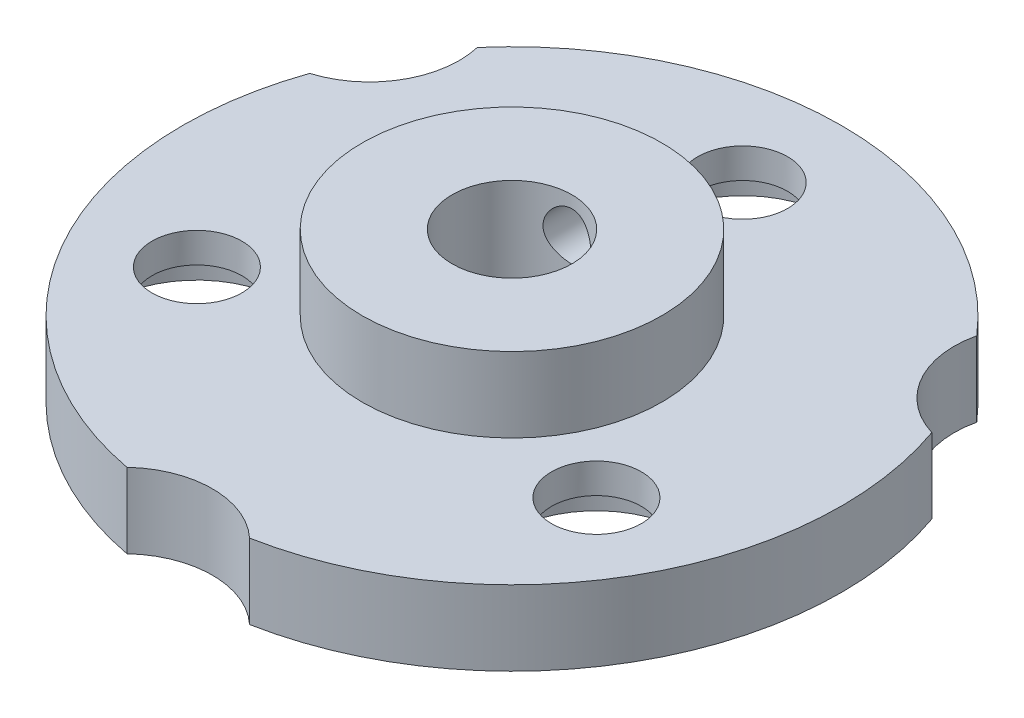
ISO-10303-21;
HEADER;
FILE_DESCRIPTION(('STEP AP214'),'2;1');
FILE_NAME('part.step','',(''),(''),'','','');
FILE_SCHEMA(('AUTOMOTIVE_DESIGN { 1 0 10303 214 1 1 1 1 }'));
ENDSEC;
DATA;
#1=APPLICATION_CONTEXT('core data for automotive mechanical design processes');
#2=APPLICATION_PROTOCOL_DEFINITION('international standard','automotive_design',2000,#1);
#3=PRODUCT_CONTEXT('',#1,'mechanical');
#4=PRODUCT('Part','Part','',(#3));
#5=PRODUCT_RELATED_PRODUCT_CATEGORY('part','',(#4));
#6=PRODUCT_DEFINITION_FORMATION('','',#4);
#7=PRODUCT_DEFINITION_CONTEXT('part definition',#1,'design');
#8=PRODUCT_DEFINITION('design','',#6,#7);
#9=PRODUCT_DEFINITION_SHAPE('','',#8);
#10=(LENGTH_UNIT() NAMED_UNIT(*) SI_UNIT(.MILLI.,.METRE.));
#11=(NAMED_UNIT(*) PLANE_ANGLE_UNIT() SI_UNIT($,.RADIAN.));
#12=(NAMED_UNIT(*) SI_UNIT($,.STERADIAN.) SOLID_ANGLE_UNIT());
#13=UNCERTAINTY_MEASURE_WITH_UNIT(LENGTH_MEASURE(1.E-05),#10,'distance_accuracy_value','');
#14=(GEOMETRIC_REPRESENTATION_CONTEXT(3) GLOBAL_UNCERTAINTY_ASSIGNED_CONTEXT((#13)) GLOBAL_UNIT_ASSIGNED_CONTEXT((#10,
#11,#12)) REPRESENTATION_CONTEXT('',''));
#15=CARTESIAN_POINT('',(0.,0.,0.));
#16=DIRECTION('',(0.,0.,1.));
#17=DIRECTION('',(1.,0.,0.));
#18=AXIS2_PLACEMENT_3D('',#15,#16,#17);
#19=CARTESIAN_POINT('',(0.,0.,-7.7));
#20=DIRECTION('',(0.,1.,0.));
#21=DIRECTION('',(0.,0.,1.));
#22=AXIS2_PLACEMENT_3D('',#19,#20,#21);
#23=CYLINDRICAL_SURFACE('',#22,1.5);
#24=CARTESIAN_POINT('',(0.,2.5,-7.7));
#25=DIRECTION('',(0.,1.,0.));
#26=DIRECTION('',(0.,0.,1.));
#27=AXIS2_PLACEMENT_3D('',#24,#25,#26);
#28=CIRCLE('',#27,1.5);
#29=CARTESIAN_POINT('',(0.,2.5,-6.2));
#30=VERTEX_POINT('',#29);
#31=EDGE_CURVE('E260',#30,#30,#28,.T.);
#32=ORIENTED_EDGE('',*,*,#31,.T.);
#33=EDGE_LOOP('',(#32));
#34=FACE_BOUND('',#33,.T.);
#35=CARTESIAN_POINT('',(0.,1.5,-7.7));
#36=DIRECTION('',(0.,-1.,0.));
#37=DIRECTION('',(0.,0.,-1.));
#38=AXIS2_PLACEMENT_3D('',#35,#36,#37);
#39=CIRCLE('',#38,1.5);
#40=CARTESIAN_POINT('',(0.,1.5,-9.2));
#41=VERTEX_POINT('',#40);
#42=EDGE_CURVE('E41',#41,#41,#39,.F.);
#43=ORIENTED_EDGE('',*,*,#42,.F.);
#44=EDGE_LOOP('',(#43));
#45=FACE_BOUND('',#44,.T.);
#46=ADVANCED_FACE('F37',(#34,#45),#23,.F.);
#47=CARTESIAN_POINT('',(-6.66839560914018,0.,3.85));
#48=DIRECTION('',(0.,1.,0.));
#49=DIRECTION('',(0.,0.,1.));
#50=AXIS2_PLACEMENT_3D('',#47,#48,#49);
#51=CYLINDRICAL_SURFACE('',#50,1.5);
#52=CARTESIAN_POINT('',(-6.66839560914018,2.5,3.85));
#53=DIRECTION('',(0.,1.,0.));
#54=DIRECTION('',(0.,0.,1.));
#55=AXIS2_PLACEMENT_3D('',#52,#53,#54);
#56=CIRCLE('',#55,1.5);
#57=CARTESIAN_POINT('',(-6.66839560914018,2.5,5.35));
#58=VERTEX_POINT('',#57);
#59=EDGE_CURVE('E265',#58,#58,#56,.T.);
#60=ORIENTED_EDGE('',*,*,#59,.T.);
#61=EDGE_LOOP('',(#60));
#62=FACE_BOUND('',#61,.T.);
#63=CARTESIAN_POINT('',(-6.66839560914018,1.5,3.85));
#64=DIRECTION('',(0.,-1.,0.));
#65=DIRECTION('',(0.,0.,-1.));
#66=AXIS2_PLACEMENT_3D('',#63,#64,#65);
#67=CIRCLE('',#66,1.5);
#68=CARTESIAN_POINT('',(-6.66839560914018,1.5,2.35));
#69=VERTEX_POINT('',#68);
#70=EDGE_CURVE('E131',#69,#69,#67,.F.);
#71=ORIENTED_EDGE('',*,*,#70,.F.);
#72=EDGE_LOOP('',(#71));
#73=FACE_BOUND('',#72,.T.);
#74=ADVANCED_FACE('F222',(#62,#73),#51,.F.);
#75=CARTESIAN_POINT('',(6.66839560914018,0.,3.85));
#76=DIRECTION('',(0.,1.,0.));
#77=DIRECTION('',(0.,0.,1.));
#78=AXIS2_PLACEMENT_3D('',#75,#76,#77);
#79=CYLINDRICAL_SURFACE('',#78,1.5);
#80=CARTESIAN_POINT('',(6.66839560914018,2.5,3.85));
#81=DIRECTION('',(0.,1.,0.));
#82=DIRECTION('',(0.,0.,1.));
#83=AXIS2_PLACEMENT_3D('',#80,#81,#82);
#84=CIRCLE('',#83,1.5);
#85=CARTESIAN_POINT('',(6.66839560914018,2.5,5.35));
#86=VERTEX_POINT('',#85);
#87=EDGE_CURVE('E261',#86,#86,#84,.T.);
#88=ORIENTED_EDGE('',*,*,#87,.T.);
#89=EDGE_LOOP('',(#88));
#90=FACE_BOUND('',#89,.T.);
#91=CARTESIAN_POINT('',(6.66839560914018,1.5,3.85));
#92=DIRECTION('',(0.,-1.,0.));
#93=DIRECTION('',(0.,0.,-1.));
#94=AXIS2_PLACEMENT_3D('',#91,#92,#93);
#95=CIRCLE('',#94,1.5);
#96=CARTESIAN_POINT('',(6.66839560914018,1.5,2.35));
#97=VERTEX_POINT('',#96);
#98=EDGE_CURVE('E107',#97,#97,#95,.F.);
#99=ORIENTED_EDGE('',*,*,#98,.F.);
#100=EDGE_LOOP('',(#99));
#101=FACE_BOUND('',#100,.T.);
#102=ADVANCED_FACE('F228',(#90,#101),#79,.F.);
#103=CARTESIAN_POINT('',(0.,2.5,0.));
#104=DIRECTION('',(0.,-1.,0.));
#105=DIRECTION('',(0.,0.,-1.));
#106=AXIS2_PLACEMENT_3D('',#103,#104,#105);
#107=CYLINDRICAL_SURFACE('',#106,11.);
#108=CARTESIAN_POINT('',(0.,0.,0.));
#109=DIRECTION('',(0.,1.,0.));
#110=DIRECTION('',(0.,0.,1.));
#111=AXIS2_PLACEMENT_3D('',#108,#109,#110);
#112=CIRCLE('',#111,11.);
#113=CARTESIAN_POINT('',(2.04787377107266,0.,10.8076923076924));
#114=VERTEX_POINT('',#113);
#115=CARTESIAN_POINT('',(10.3836729802836,0.,-3.63033544435343));
#116=VERTEX_POINT('',#115);
#117=EDGE_CURVE('E116',#114,#116,#112,.T.);
#118=ORIENTED_EDGE('',*,*,#117,.T.);
#119=DIRECTION('',(0.,1.,0.));
#120=VECTOR('',#119,1.);
#121=CARTESIAN_POINT('',(10.3836729802836,-0.25,-3.63033544435342));
#122=LINE('',#121,#120);
#123=CARTESIAN_POINT('',(10.3836729802836,2.5,-3.63033544435342));
#124=VERTEX_POINT('',#123);
#125=EDGE_CURVE('E54',#116,#124,#122,.T.);
#126=ORIENTED_EDGE('',*,*,#125,.T.);
#127=CARTESIAN_POINT('',(0.,2.5,0.));
#128=DIRECTION('',(0.,1.,0.));
#129=DIRECTION('',(0.,0.,1.));
#130=AXIS2_PLACEMENT_3D('',#127,#128,#129);
#131=CIRCLE('',#130,11.);
#132=CARTESIAN_POINT('',(2.04787377107267,2.5,10.8076923076924));
#133=VERTEX_POINT('',#132);
#134=EDGE_CURVE('E106',#133,#124,#131,.T.);
#135=ORIENTED_EDGE('',*,*,#134,.F.);
#136=DIRECTION('',(0.,1.,0.));
#137=VECTOR('',#136,1.);
#138=CARTESIAN_POINT('',(2.04787377107266,-0.25,10.8076923076924));
#139=LINE('',#138,#137);
#140=EDGE_CURVE('E155',#133,#114,#139,.F.);
#141=ORIENTED_EDGE('',*,*,#140,.T.);
#142=EDGE_LOOP('',(#118,#126,#135,#141));
#143=FACE_BOUND('',#142,.T.);
#144=ADVANCED_FACE('F247',(#143),#107,.T.);
#145=CARTESIAN_POINT('',(-10.3836729802836,0.,-3.6303354443534));
#146=VERTEX_POINT('',#145);
#147=CARTESIAN_POINT('',(-2.04787377107266,0.,10.8076923076924));
#148=VERTEX_POINT('',#147);
#149=EDGE_CURVE('E112',#146,#148,#112,.T.);
#150=ORIENTED_EDGE('',*,*,#149,.T.);
#151=DIRECTION('',(0.,1.,0.));
#152=VECTOR('',#151,1.);
#153=CARTESIAN_POINT('',(-2.04787377107266,-0.25,10.8076923076924));
#154=LINE('',#153,#152);
#155=CARTESIAN_POINT('',(-2.04787377107267,2.5,10.8076923076924));
#156=VERTEX_POINT('',#155);
#157=EDGE_CURVE('E61',#148,#156,#154,.T.);
#158=ORIENTED_EDGE('',*,*,#157,.T.);
#159=CARTESIAN_POINT('',(-10.3836729802836,2.5,-3.63033544435341));
#160=VERTEX_POINT('',#159);
#161=EDGE_CURVE('E114',#160,#156,#131,.T.);
#162=ORIENTED_EDGE('',*,*,#161,.F.);
#163=DIRECTION('',(0.,1.,0.));
#164=VECTOR('',#163,1.);
#165=CARTESIAN_POINT('',(-10.3836729802836,-0.25,-3.63033544435341));
#166=LINE('',#165,#164);
#167=EDGE_CURVE('E161',#160,#146,#166,.F.);
#168=ORIENTED_EDGE('',*,*,#167,.T.);
#169=EDGE_LOOP('',(#150,#158,#162,#168));
#170=FACE_BOUND('',#169,.T.);
#171=ADVANCED_FACE('F236',(#170),#107,.T.);
#172=CARTESIAN_POINT('',(0.,2.5,0.));
#173=DIRECTION('',(0.,1.,0.));
#174=DIRECTION('',(0.,0.,1.));
#175=AXIS2_PLACEMENT_3D('',#172,#173,#174);
#176=PLANE('',#175);
#177=CARTESIAN_POINT('',(11.258330249198,2.5,-6.50000000000016));
#178=DIRECTION('',(0.,1.,0.));
#179=DIRECTION('',(0.,0.,1.));
#180=AXIS2_PLACEMENT_3D('',#177,#178,#179);
#181=CIRCLE('',#180,3.);
#182=CARTESIAN_POINT('',(8.33579920921091,2.5,-7.17735686333895));
#183=VERTEX_POINT('',#182);
#184=EDGE_CURVE('E92',#183,#124,#181,.T.);
#185=ORIENTED_EDGE('',*,*,#184,.F.);
#186=CARTESIAN_POINT('',(-8.33579920921092,2.5,-7.17735686333894));
#187=VERTEX_POINT('',#186);
#188=EDGE_CURVE('E102',#183,#187,#131,.T.);
#189=ORIENTED_EDGE('',*,*,#188,.T.);
#190=CARTESIAN_POINT('',(-11.258330249198,2.5,-6.50000000000015));
#191=DIRECTION('',(0.,1.,0.));
#192=DIRECTION('',(0.,0.,1.));
#193=AXIS2_PLACEMENT_3D('',#190,#191,#192);
#194=CIRCLE('',#193,3.);
#195=EDGE_CURVE('E159',#160,#187,#194,.T.);
#196=ORIENTED_EDGE('',*,*,#195,.F.);
#197=ORIENTED_EDGE('',*,*,#161,.T.);
#198=CARTESIAN_POINT('',(0.,2.5,13.0000000000003));
#199=DIRECTION('',(0.,1.,0.));
#200=DIRECTION('',(0.,0.,1.));
#201=AXIS2_PLACEMENT_3D('',#198,#199,#200);
#202=CIRCLE('',#201,3.);
#203=EDGE_CURVE('E153',#133,#156,#202,.T.);
#204=ORIENTED_EDGE('',*,*,#203,.F.);
#205=ORIENTED_EDGE('',*,*,#134,.T.);
#206=EDGE_LOOP('',(#185,#189,#196,#197,#204,#205));
#207=FACE_BOUND('',#206,.T.);
#208=ORIENTED_EDGE('',*,*,#31,.F.);
#209=EDGE_LOOP('',(#208));
#210=FACE_BOUND('',#209,.T.);
#211=ORIENTED_EDGE('',*,*,#87,.F.);
#212=EDGE_LOOP('',(#211));
#213=FACE_BOUND('',#212,.T.);
#214=ORIENTED_EDGE('',*,*,#59,.F.);
#215=EDGE_LOOP('',(#214));
#216=FACE_BOUND('',#215,.T.);
#217=CARTESIAN_POINT('',(0.,2.5,0.));
#218=DIRECTION('',(0.,1.,0.));
#219=DIRECTION('',(0.,0.,1.));
#220=AXIS2_PLACEMENT_3D('',#217,#218,#219);
#221=CIRCLE('',#220,5.);
#222=CARTESIAN_POINT('',(0.,2.5,5.));
#223=VERTEX_POINT('',#222);
#224=EDGE_CURVE('E271',#223,#223,#221,.T.);
#225=ORIENTED_EDGE('',*,*,#224,.F.);
#226=EDGE_LOOP('',(#225));
#227=FACE_BOUND('',#226,.T.);
#228=ADVANCED_FACE('F99',(#207,#210,#213,#216,#227),#176,.T.);
#229=ORIENTED_EDGE('',*,*,#188,.F.);
#230=DIRECTION('',(0.,1.,0.));
#231=VECTOR('',#230,1.);
#232=CARTESIAN_POINT('',(8.33579920921091,-0.25,-7.17735686333894));
#233=LINE('',#232,#231);
#234=CARTESIAN_POINT('',(8.33579920921092,0.,-7.17735686333894));
#235=VERTEX_POINT('',#234);
#236=EDGE_CURVE('E89',#183,#235,#233,.F.);
#237=ORIENTED_EDGE('',*,*,#236,.T.);
#238=CARTESIAN_POINT('',(-8.33579920921091,0.,-7.17735686333895));
#239=VERTEX_POINT('',#238);
#240=EDGE_CURVE('E118',#235,#239,#112,.T.);
#241=ORIENTED_EDGE('',*,*,#240,.T.);
#242=DIRECTION('',(0.,1.,0.));
#243=VECTOR('',#242,1.);
#244=CARTESIAN_POINT('',(-8.33579920921092,-0.25,-7.17735686333895));
#245=LINE('',#244,#243);
#246=EDGE_CURVE('E111',#239,#187,#245,.T.);
#247=ORIENTED_EDGE('',*,*,#246,.T.);
#248=EDGE_LOOP('',(#229,#237,#241,#247));
#249=FACE_BOUND('',#248,.T.);
#250=ADVANCED_FACE('F39',(#249),#107,.T.);
#251=CARTESIAN_POINT('',(0.,0.,0.));
#252=DIRECTION('',(0.,1.,0.));
#253=DIRECTION('',(0.,0.,1.));
#254=AXIS2_PLACEMENT_3D('',#251,#252,#253);
#255=PLANE('',#254);
#256=CARTESIAN_POINT('',(0.,0.,-7.7));
#257=DIRECTION('',(0.,-1.,0.));
#258=DIRECTION('',(0.,0.,-1.));
#259=AXIS2_PLACEMENT_3D('',#256,#257,#258);
#260=CIRCLE('',#259,3.);
#261=CARTESIAN_POINT('',(0.,0.,-10.7));
#262=VERTEX_POINT('',#261);
#263=EDGE_CURVE('E147',#262,#262,#260,.T.);
#264=ORIENTED_EDGE('',*,*,#263,.F.);
#265=EDGE_LOOP('',(#264));
#266=FACE_BOUND('',#265,.T.);
#267=CARTESIAN_POINT('',(-6.66839560914018,0.,3.85));
#268=DIRECTION('',(0.,-1.,0.));
#269=DIRECTION('',(0.,0.,-1.));
#270=AXIS2_PLACEMENT_3D('',#267,#268,#269);
#271=CIRCLE('',#270,3.);
#272=CARTESIAN_POINT('',(-6.66839560914018,0.,0.850000000000001));
#273=VERTEX_POINT('',#272);
#274=EDGE_CURVE('E140',#273,#273,#271,.T.);
#275=ORIENTED_EDGE('',*,*,#274,.F.);
#276=EDGE_LOOP('',(#275));
#277=FACE_BOUND('',#276,.T.);
#278=CARTESIAN_POINT('',(6.66839560914018,0.,3.85));
#279=DIRECTION('',(0.,-1.,0.));
#280=DIRECTION('',(0.,0.,-1.));
#281=AXIS2_PLACEMENT_3D('',#278,#279,#280);
#282=CIRCLE('',#281,3.);
#283=CARTESIAN_POINT('',(6.66839560914018,0.,0.849999999999996));
#284=VERTEX_POINT('',#283);
#285=EDGE_CURVE('E133',#284,#284,#282,.T.);
#286=ORIENTED_EDGE('',*,*,#285,.F.);
#287=EDGE_LOOP('',(#286));
#288=FACE_BOUND('',#287,.T.);
#289=CARTESIAN_POINT('',(0.,0.,0.));
#290=DIRECTION('',(0.,1.,0.));
#291=DIRECTION('',(0.,0.,1.));
#292=AXIS2_PLACEMENT_3D('',#289,#290,#291);
#293=CIRCLE('',#292,2.);
#294=CARTESIAN_POINT('',(0.,0.,2.));
#295=VERTEX_POINT('',#294);
#296=EDGE_CURVE('E257',#295,#295,#293,.T.);
#297=ORIENTED_EDGE('',*,*,#296,.T.);
#298=EDGE_LOOP('',(#297));
#299=FACE_BOUND('',#298,.T.);
#300=ORIENTED_EDGE('',*,*,#240,.F.);
#301=CARTESIAN_POINT('',(11.258330249198,0.,-6.50000000000016));
#302=DIRECTION('',(0.,1.,0.));
#303=DIRECTION('',(0.,0.,1.));
#304=AXIS2_PLACEMENT_3D('',#301,#302,#303);
#305=CIRCLE('',#304,3.);
#306=EDGE_CURVE('E11',#235,#116,#305,.T.);
#307=ORIENTED_EDGE('',*,*,#306,.T.);
#308=ORIENTED_EDGE('',*,*,#117,.F.);
#309=CARTESIAN_POINT('',(0.,0.,13.0000000000003));
#310=DIRECTION('',(0.,1.,0.));
#311=DIRECTION('',(0.,0.,1.));
#312=AXIS2_PLACEMENT_3D('',#309,#310,#311);
#313=CIRCLE('',#312,3.);
#314=EDGE_CURVE('E46',#114,#148,#313,.T.);
#315=ORIENTED_EDGE('',*,*,#314,.T.);
#316=ORIENTED_EDGE('',*,*,#149,.F.);
#317=CARTESIAN_POINT('',(-11.258330249198,0.,-6.50000000000015));
#318=DIRECTION('',(0.,1.,0.));
#319=DIRECTION('',(0.,0.,1.));
#320=AXIS2_PLACEMENT_3D('',#317,#318,#319);
#321=CIRCLE('',#320,3.);
#322=EDGE_CURVE('E121',#146,#239,#321,.T.);
#323=ORIENTED_EDGE('',*,*,#322,.T.);
#324=EDGE_LOOP('',(#300,#307,#308,#315,#316,#323));
#325=FACE_BOUND('',#324,.T.);
#326=ADVANCED_FACE('F237',(#266,#277,#288,#299,#325),#255,.F.);
#327=CARTESIAN_POINT('',(0.,5.,0.));
#328=DIRECTION('',(0.,-1.,0.));
#329=DIRECTION('',(0.,0.,-1.));
#330=AXIS2_PLACEMENT_3D('',#327,#328,#329);
#331=CYLINDRICAL_SURFACE('',#330,5.);
#332=CARTESIAN_POINT('',(0.,4.59295521709407,-5.));
#333=CARTESIAN_POINT('',(-0.0446345464348316,4.59280840972483,-4.99999925421206));
#334=CARTESIAN_POINT('',(-0.0892819443510242,4.58891705369241,-4.9993960875234));
#335=CARTESIAN_POINT('',(-0.177301891678728,4.57375034444032,-4.99704993433986));
#336=CARTESIAN_POINT('',(-0.220673197606512,4.56246802289334,-4.99530587219164));
#337=CARTESIAN_POINT('',(-0.304854977903623,4.53286726162526,-4.99087558705497));
#338=CARTESIAN_POINT('',(-0.345667459361672,4.51455441889718,-4.98819011367073));
#339=CARTESIAN_POINT('',(-0.423635297501168,4.47142634078325,-4.98217463731942));
#340=CARTESIAN_POINT('',(-0.460791109846802,4.44661191698616,-4.97884471481213));
#341=CARTESIAN_POINT('',(-0.530725668288756,4.39095066663555,-4.97187860497349));
#342=CARTESIAN_POINT('',(-0.563467348194365,4.36005754142336,-4.96824019736804));
#343=CARTESIAN_POINT('',(-0.623325168104831,4.29321676146511,-4.96108624127247));
#344=CARTESIAN_POINT('',(-0.65044097100112,4.25726880404452,-4.95757070015512));
#345=CARTESIAN_POINT('',(-0.698418461816593,4.18109293926852,-4.95104061891818));
#346=CARTESIAN_POINT('',(-0.719244831066636,4.1408425198778,-4.94802894895029));
#347=CARTESIAN_POINT('',(-0.753826505269509,4.0573583918758,-4.9428790397377));
#348=CARTESIAN_POINT('',(-0.767582254949823,4.01412487108954,-4.94074074556118));
#349=CARTESIAN_POINT('',(-0.787517076478005,3.9262960935183,-4.93760253956309));
#350=CARTESIAN_POINT('',(-0.793760297058812,3.88171574712982,-4.93659299479914));
#351=CARTESIAN_POINT('',(-0.798690889447807,3.79212975820018,-4.93579776042976));
#352=CARTESIAN_POINT('',(-0.797378748811149,3.74712414328914,-4.9360119918528));
#353=CARTESIAN_POINT('',(-0.787288858704428,3.65841063797979,-4.93763113481972));
#354=CARTESIAN_POINT('',(-0.778581283745994,3.61469453280229,-4.93902485388638));
#355=CARTESIAN_POINT('',(-0.754056623447392,3.52935153996084,-4.94282826426096));
#356=CARTESIAN_POINT('',(-0.738239305621584,3.48772472066515,-4.94523798879167));
#357=CARTESIAN_POINT('',(-0.699868024192296,3.40752234623804,-4.95081411790351));
#358=CARTESIAN_POINT('',(-0.677283485215569,3.36896166684932,-4.9539839434747));
#359=CARTESIAN_POINT('',(-0.626041212269116,3.29614996590887,-4.9607195182505));
#360=CARTESIAN_POINT('',(-0.597383026549834,3.26189926522965,-4.96428529689616));
#361=CARTESIAN_POINT('',(-0.534418967683776,3.19827161328361,-4.97145948250141));
#362=CARTESIAN_POINT('',(-0.50005254880277,3.16895454552508,-4.97506791289196));
#363=CARTESIAN_POINT('',(-0.42685535233901,3.1164946643916,-4.98188150665978));
#364=CARTESIAN_POINT('',(-0.38802455481584,3.09335187859599,-4.98508666823568));
#365=CARTESIAN_POINT('',(-0.306953152851501,3.05389666610303,-4.99073439993172));
#366=CARTESIAN_POINT('',(-0.264710579067384,3.03758821841365,-4.99317652559617));
#367=CARTESIAN_POINT('',(-0.178038476907495,3.0123135850691,-4.99701733008075));
#368=CARTESIAN_POINT('',(-0.13360911778908,3.00334683211061,-4.99841608952256));
#369=CARTESIAN_POINT('',(-0.044342834257701,2.99308885599945,-5.00000045238604));
#370=CARTESIAN_POINT('',(0.000484388161033505,2.99171513888676,-5.00019909658237));
#371=CARTESIAN_POINT('',(0.0897277032897241,2.99646392886732,-4.99939398406668));
#372=CARTESIAN_POINT('',(0.134143810122924,3.00258617747796,-4.99839026881552));
#373=CARTESIAN_POINT('',(0.22105882533659,3.02208504347061,-4.99529929653219));
#374=CARTESIAN_POINT('',(0.263566806501662,3.03542223188221,-4.99321793138338));
#375=CARTESIAN_POINT('',(0.345743289629188,3.06893109522977,-4.98820186778873));
#376=CARTESIAN_POINT('',(0.385411640694738,3.08910313304104,-4.98526712403657));
#377=CARTESIAN_POINT('',(0.461145134721015,3.13590295965188,-4.97883553280157));
#378=CARTESIAN_POINT('',(0.497177643904882,3.16258293348531,-4.97533422270727));
#379=CARTESIAN_POINT('',(0.564283089849041,3.22156791963511,-4.9681712513089));
#380=CARTESIAN_POINT('',(0.5953556984032,3.25387330390017,-4.9645095794138));
#381=CARTESIAN_POINT('',(0.651957795364867,3.3235577117943,-4.9573959412819));
#382=CARTESIAN_POINT('',(0.677432262603727,3.36098169719568,-4.95394627756548));
#383=CARTESIAN_POINT('',(0.721732833216672,3.43962673186725,-4.9476867714127));
#384=CARTESIAN_POINT('',(0.740559142226743,3.48084766364334,-4.94487690918741));
#385=CARTESIAN_POINT('',(0.770943170127828,3.56575058190925,-4.94023112007101));
#386=CARTESIAN_POINT('',(0.782530149288916,3.60942187342313,-4.93839127728325));
#387=CARTESIAN_POINT('',(0.798199803671995,3.69812236414841,-4.93588301608632));
#388=CARTESIAN_POINT('',(0.80228307355758,3.74315145546765,-4.93521450485016));
#389=CARTESIAN_POINT('',(0.802815962429547,3.83273817599765,-4.93512779371066));
#390=CARTESIAN_POINT('',(0.799352463469281,3.87729529912648,-4.93569536340789));
#391=CARTESIAN_POINT('',(0.785075890692146,3.96518430315666,-4.93798615841887));
#392=CARTESIAN_POINT('',(0.774262828172747,4.00851618594129,-4.93970938195619));
#393=CARTESIAN_POINT('',(0.745624187596051,4.09270216575181,-4.94411292837317));
#394=CARTESIAN_POINT('',(0.72780443654043,4.1335582892027,-4.94679245578731));
#395=CARTESIAN_POINT('',(0.685666554935636,4.21171525048427,-4.9528085340871));
#396=CARTESIAN_POINT('',(0.661348141854871,4.24901593364528,-4.95614511353666));
#397=CARTESIAN_POINT('',(0.606587081465112,4.3194447098727,-4.96314620762862));
#398=CARTESIAN_POINT('',(0.576080086044314,4.3525224588935,-4.9668139223735));
#399=CARTESIAN_POINT('',(0.509945409149723,4.41311877418437,-4.97403858748415));
#400=CARTESIAN_POINT('',(0.474316548786267,4.44063605709539,-4.97759551211962));
#401=CARTESIAN_POINT('',(0.398688189514486,4.48948390134341,-4.98422474154444));
#402=CARTESIAN_POINT('',(0.358663017320115,4.51077513877548,-4.98729391237595));
#403=CARTESIAN_POINT('',(0.275572401990431,4.54629917536374,-4.99257309312883));
#404=CARTESIAN_POINT('',(0.232510090751467,4.56053912765659,-4.9947839732444));
#405=CARTESIAN_POINT('',(0.157722389070858,4.57841711433275,-4.99760747858701));
#406=CARTESIAN_POINT('',(0.12644710954531,4.58395060419822,-4.99850013479712));
#407=CARTESIAN_POINT('',(0.0634500468027396,4.59127180597416,-4.99969665612681));
#408=CARTESIAN_POINT('',(0.0317282703374389,4.59305957446456,-5.00000053014007));
#409=CARTESIAN_POINT('',(0.,4.59295521709407,-5.));
#410=B_SPLINE_CURVE_WITH_KNOTS('',3,(#332,#333,#334,#335,#336,#337,#338,#339,#340,#341,#342,
#343,#344,#345,#346,#347,#348,#349,#350,#351,#352,#353,#354,#355,#356,#357,#358,#359,#360,#361,
#362,#363,#364,#365,#366,#367,#368,#369,#370,#371,#372,#373,#374,#375,#376,#377,#378,#379,#380,
#381,#382,#383,#384,#385,#386,#387,#388,#389,#390,#391,#392,#393,#394,#395,#396,#397,#398,#399,
#400,#401,#402,#403,#404,#405,#406,#407,#408,#409),.UNSPECIFIED.,.T.,.F.,(4,2,2,2,2,2,2,2,2,2,2,
2,2,2,2,2,2,2,2,2,2,2,2,2,2,2,2,2,2,2,2,2,2,2,2,2,2,2,4),(0.,0.13378838513054,0.267703090104947,
0.401511406008695,0.53530302664602,0.67015614056743,0.805017332699413,0.940622335585658,
1.07621880815102,1.21064902767123,1.34507057236969,1.47823067492863,1.61139513208443,
1.74517055974791,1.87895594093933,2.0142634358785,2.1495715352002,2.28495830293329,
2.42033460814825,2.5542371933749,2.68813516138256,2.82130867464519,2.9544892594542,
3.08877506801447,3.22306975884367,3.35863055099062,3.49418714970259,3.62919224330306,
3.76418663738493,3.89763512942673,4.03108341633702,4.16442095702511,4.2977642955525,
4.43257259927339,4.56741198138661,4.70308547687108,4.83862105572566,4.93372537539903,
5.02882825849047),.UNSPECIFIED.);
#411=CARTESIAN_POINT('',(0.,4.59295521709407,-5.));
#412=VERTEX_POINT('',#411);
#413=EDGE_CURVE('E172',#412,#412,#410,.T.);
#414=ORIENTED_EDGE('',*,*,#413,.T.);
#415=EDGE_LOOP('',(#414));
#416=FACE_BOUND('',#415,.T.);
#417=CARTESIAN_POINT('',(0.,5.,0.));
#418=DIRECTION('',(0.,1.,0.));
#419=DIRECTION('',(0.,0.,1.));
#420=AXIS2_PLACEMENT_3D('',#417,#418,#419);
#421=CIRCLE('',#420,5.);
#422=CARTESIAN_POINT('',(0.,5.,5.));
#423=VERTEX_POINT('',#422);
#424=EDGE_CURVE('E270',#423,#423,#421,.T.);
#425=ORIENTED_EDGE('',*,*,#424,.F.);
#426=EDGE_LOOP('',(#425));
#427=FACE_BOUND('',#426,.T.);
#428=ORIENTED_EDGE('',*,*,#224,.T.);
#429=EDGE_LOOP('',(#428));
#430=FACE_BOUND('',#429,.T.);
#431=ADVANCED_FACE('F239',(#416,#427,#430),#331,.T.);
#432=CARTESIAN_POINT('',(0.,5.,0.));
#433=DIRECTION('',(0.,1.,0.));
#434=DIRECTION('',(0.,0.,1.));
#435=AXIS2_PLACEMENT_3D('',#432,#433,#434);
#436=PLANE('',#435);
#437=CARTESIAN_POINT('',(0.,5.,0.));
#438=DIRECTION('',(0.,1.,0.));
#439=DIRECTION('',(0.,0.,1.));
#440=AXIS2_PLACEMENT_3D('',#437,#438,#439);
#441=CIRCLE('',#440,2.);
#442=CARTESIAN_POINT('',(0.,5.,2.));
#443=VERTEX_POINT('',#442);
#444=EDGE_CURVE('E276',#443,#443,#441,.T.);
#445=ORIENTED_EDGE('',*,*,#444,.F.);
#446=EDGE_LOOP('',(#445));
#447=FACE_BOUND('',#446,.T.);
#448=ORIENTED_EDGE('',*,*,#424,.T.);
#449=EDGE_LOOP('',(#448));
#450=FACE_BOUND('',#449,.T.);
#451=ADVANCED_FACE('F245',(#447,#450),#436,.T.);
#452=CARTESIAN_POINT('',(0.,-0.5,0.));
#453=DIRECTION('',(0.,1.,0.));
#454=DIRECTION('',(0.,0.,1.));
#455=AXIS2_PLACEMENT_3D('',#452,#453,#454);
#456=CYLINDRICAL_SURFACE('',#455,2.);
#457=CARTESIAN_POINT('',(-0.799047163232818,3.79295943814312,-1.83344583528655));
#458=CARTESIAN_POINT('',(-0.799042462665129,3.83581523738308,-1.83345016148733));
#459=CARTESIAN_POINT('',(-0.795582298961549,3.878731652025,-1.83496816656248));
#460=CARTESIAN_POINT('',(-0.781870924640441,3.96333337129395,-1.84085028760057));
#461=CARTESIAN_POINT('',(-0.771602360737395,4.00501524497531,-1.84522167583811));
#462=CARTESIAN_POINT('',(-0.744729327155326,4.08578061493114,-1.85622915151898));
#463=CARTESIAN_POINT('',(-0.728148728191182,4.12487325708722,-1.86285669680964));
#464=CARTESIAN_POINT('',(-0.689192297844297,4.19971345848697,-1.87761712591288));
#465=CARTESIAN_POINT('',(-0.666817731835192,4.23546174580346,-1.88574968092829));
#466=CARTESIAN_POINT('',(-0.61553971281123,4.3046635990397,-1.90312364779918));
#467=CARTESIAN_POINT('',(-0.58635784032435,4.33790200731491,-1.91240069322624));
#468=CARTESIAN_POINT('',(-0.522880208430892,4.39917103706927,-1.93072185889342));
#469=CARTESIAN_POINT('',(-0.488582669464804,4.42719983865906,-1.93976589678943));
#470=CARTESIAN_POINT('',(-0.414185402195358,4.4783219969362,-1.95702917136805));
#471=CARTESIAN_POINT('',(-0.373910211072265,4.50117715873138,-1.96520182230166));
#472=CARTESIAN_POINT('',(-0.289701380398092,4.53969686549904,-1.97936655195159));
#473=CARTESIAN_POINT('',(-0.245769238148499,4.5553643364559,-1.9853595177737));
#474=CARTESIAN_POINT('',(-0.157750075902051,4.57829603271808,-1.99423556096864));
#475=CARTESIAN_POINT('',(-0.113773523697688,4.58593036377873,-1.99725515136257));
#476=CARTESIAN_POINT('',(-0.0250668487170981,4.5937708324082,-2.00033454157052));
#477=CARTESIAN_POINT('',(0.0196629867650228,4.59397974051706,-2.00039544531936));
#478=CARTESIAN_POINT('',(0.105931294208234,4.58716633023313,-1.99763306267521));
#479=CARTESIAN_POINT('',(0.147507899770072,4.58054952904435,-1.99497158842065));
#480=CARTESIAN_POINT('',(0.228902174751906,4.56096228761882,-1.98727846099662));
#481=CARTESIAN_POINT('',(0.268719714875988,4.54799138118296,-1.98224663391601));
#482=CARTESIAN_POINT('',(0.346183249643455,4.5159048449926,-1.97020763308979));
#483=CARTESIAN_POINT('',(0.383787471768839,4.49669955221691,-1.96317183115119));
#484=CARTESIAN_POINT('',(0.455335714177723,4.45277343537552,-1.94782194029242));
#485=CARTESIAN_POINT('',(0.489278474026521,4.42805072090407,-1.93950741355362));
#486=CARTESIAN_POINT('',(0.554906472629294,4.37189978376448,-1.92179839226061));
#487=CARTESIAN_POINT('',(0.5862971827107,4.34013788110959,-1.91236883284082));
#488=CARTESIAN_POINT('',(0.643427425666816,4.27176320941473,-1.89391247433249));
#489=CARTESIAN_POINT('',(0.669165108827851,4.23514885888145,-1.88488580784111));
#490=CARTESIAN_POINT('',(0.714932684947926,4.15679182917954,-1.86801625144648));
#491=CARTESIAN_POINT('',(0.734780817558316,4.11493350594959,-1.86021400116244));
#492=CARTESIAN_POINT('',(0.767030676121989,4.02807324195832,-1.84715194248046));
#493=CARTESIAN_POINT('',(0.779437238497369,3.98307336423478,-1.8418904832071));
#494=CARTESIAN_POINT('',(0.795735790485013,3.8941451271687,-1.83490569798837));
#495=CARTESIAN_POINT('',(0.800101652415495,3.85031925929505,-1.83298585564763));
#496=CARTESIAN_POINT('',(0.801577009622713,3.76252855503594,-1.83234161445076));
#497=CARTESIAN_POINT('',(0.798688705387978,3.71856376483198,-1.83361624657819));
#498=CARTESIAN_POINT('',(0.786169103831121,3.63437586416117,-1.83901580962576));
#499=CARTESIAN_POINT('',(0.776931226908908,3.59408226318332,-1.84297426536607));
#500=CARTESIAN_POINT('',(0.752484930936957,3.51564407622872,-1.85308934576475));
#501=CARTESIAN_POINT('',(0.737275188035647,3.4774999689002,-1.85924645779688));
#502=CARTESIAN_POINT('',(0.700628046591326,3.40271849502493,-1.8733712247657));
#503=CARTESIAN_POINT('',(0.678963109315052,3.36620496266534,-1.88140217745099));
#504=CARTESIAN_POINT('',(0.630252814553537,3.29716624316645,-1.89827421927866));
#505=CARTESIAN_POINT('',(0.603205265897456,3.26464268902488,-1.90711563755479));
#506=CARTESIAN_POINT('',(0.542138497452123,3.20201007470344,-1.92540214415289));
#507=CARTESIAN_POINT('',(0.507751887159073,3.17225681202671,-1.93484358333461));
#508=CARTESIAN_POINT('',(0.434248415737529,3.11888860749899,-1.95265373874898));
#509=CARTESIAN_POINT('',(0.395131362162266,3.09527391550423,-1.96102241131014));
#510=CARTESIAN_POINT('',(0.31313893568456,3.05494038755863,-1.97577237459626));
#511=CARTESIAN_POINT('',(0.270264465652491,3.03821990047681,-1.98215414108649));
#512=CARTESIAN_POINT('',(0.181992917293087,3.01233989718007,-1.99219653103666));
#513=CARTESIAN_POINT('',(0.136597222310328,3.00317627756709,-1.9958586311747));
#514=CARTESIAN_POINT('',(0.0477660664283575,2.99315755749297,-1.99989147626839));
#515=CARTESIAN_POINT('',(0.00439594967590276,2.99179938675806,-2.0004613723665));
#516=CARTESIAN_POINT('',(-0.0819346635675842,2.99610162985676,-1.99878702553996));
#517=CARTESIAN_POINT('',(-0.124895221072546,3.00176098125737,-1.99654320860292));
#518=CARTESIAN_POINT('',(-0.20783428501033,3.01957815348651,-1.98959434533991));
#519=CARTESIAN_POINT('',(-0.247863856579023,3.03153101657334,-1.98496701941007));
#520=CARTESIAN_POINT('',(-0.325343117641277,3.06138055996785,-1.97374915700592));
#521=CARTESIAN_POINT('',(-0.362792329762865,3.07927833655126,-1.96715825846082));
#522=CARTESIAN_POINT('',(-0.435866556162932,3.12140071753886,-1.95229918545447));
#523=CARTESIAN_POINT('',(-0.471337828202997,3.14586995609716,-1.94396976221287));
#524=CARTESIAN_POINT('',(-0.537820302467071,3.2000748458147,-1.9266374083776));
#525=CARTESIAN_POINT('',(-0.568829649016991,3.22981267672717,-1.91763419991543));
#526=CARTESIAN_POINT('',(-0.627493429707887,3.29588552795314,-1.89927745433076));
#527=CARTESIAN_POINT('',(-0.654821337141413,3.33251498750356,-1.88993673310011));
#528=CARTESIAN_POINT('',(-0.702965798364049,3.41013629311463,-1.8725643096112));
#529=CARTESIAN_POINT('',(-0.723781586606339,3.45112865130706,-1.86453276130882));
#530=CARTESIAN_POINT('',(-0.756634245727276,3.53257431888235,-1.85142897319136));
#531=CARTESIAN_POINT('',(-0.769291558814078,3.57274553204359,-1.84615576781002));
#532=CARTESIAN_POINT('',(-0.788131797050599,3.65475360599526,-1.83819389903301));
#533=CARTESIAN_POINT('',(-0.794332763107594,3.69658548452991,-1.83549803553178));
#534=CARTESIAN_POINT('',(-0.798432727575449,3.75671046307829,-1.83371307301415));
#535=CARTESIAN_POINT('',(-0.799049151782284,3.77482952654216,-1.83344400511095));
#536=CARTESIAN_POINT('',(-0.799047163232818,3.79295943814312,-1.83344583528655));
#537=B_SPLINE_CURVE_WITH_KNOTS('',3,(#457,#458,#459,#460,#461,#462,#463,#464,#465,#466,#467,
#468,#469,#470,#471,#472,#473,#474,#475,#476,#477,#478,#479,#480,#481,#482,#483,#484,#485,#486,
#487,#488,#489,#490,#491,#492,#493,#494,#495,#496,#497,#498,#499,#500,#501,#502,#503,#504,#505,
#506,#507,#508,#509,#510,#511,#512,#513,#514,#515,#516,#517,#518,#519,#520,#521,#522,#523,#524,
#525,#526,#527,#528,#529,#530,#531,#532,#533,#534,#535,#536),.UNSPECIFIED.,.T.,.F.,(4,2,2,2,2,2,
2,2,2,2,2,2,2,2,2,2,2,2,2,2,2,2,2,2,2,2,2,2,2,2,2,2,2,2,2,2,2,2,2,4),(0.,0.128511059507061,
0.257350934328898,0.385708329317355,0.514037715295445,0.649022473137699,0.784054297393369,
0.924410676365712,1.06470986787792,1.19821673154873,1.33167378122269,1.45763457932121,
1.58360462051624,1.71147320093959,1.83938565976012,1.97569617632542,2.11205122850851,
2.2522578348583,2.39237321917645,2.52392859007372,2.6554440596078,2.77946899231662,
2.90352143458259,3.03260461858684,3.16174045807944,3.30041493696396,3.43909505938703,
3.57774194922729,3.71631350379258,3.84584415899985,3.97535520602644,4.10088797774945,
4.22644391129038,4.35754820453574,4.48870686623286,4.62798501311849,4.76727952701279,
4.89406664325234,5.02049852085301,5.07486442208293),.UNSPECIFIED.);
#538=CARTESIAN_POINT('',(-0.799047163232818,3.79295943814312,-1.83344583528655));
#539=VERTEX_POINT('',#538);
#540=EDGE_CURVE('E165',#539,#539,#537,.T.);
#541=ORIENTED_EDGE('',*,*,#540,.T.);
#542=EDGE_LOOP('',(#541));
#543=FACE_BOUND('',#542,.T.);
#544=ORIENTED_EDGE('',*,*,#444,.T.);
#545=EDGE_LOOP('',(#544));
#546=FACE_BOUND('',#545,.T.);
#547=ORIENTED_EDGE('',*,*,#296,.F.);
#548=EDGE_LOOP('',(#547));
#549=FACE_BOUND('',#548,.T.);
#550=ADVANCED_FACE('F184',(#543,#546,#549),#456,.F.);
#551=CARTESIAN_POINT('',(0.002598780609484,3.79295943814312,-4.99999932463389));
#552=DIRECTION('',(0.000519756121896799,0.,-0.999999864926778));
#553=DIRECTION('',(-0.999999864926778,0.,-0.000519756121896799));
#554=AXIS2_PLACEMENT_3D('',#551,#552,#553);
#555=CYLINDRICAL_SURFACE('',#554,0.799999999999999);
#556=ORIENTED_EDGE('',*,*,#540,.F.);
#557=EDGE_LOOP('',(#556));
#558=FACE_BOUND('',#557,.T.);
#559=ORIENTED_EDGE('',*,*,#413,.F.);
#560=EDGE_LOOP('',(#559));
#561=FACE_BOUND('',#560,.T.);
#562=ADVANCED_FACE('F179',(#558,#561),#555,.F.);
#563=CARTESIAN_POINT('',(-11.258330249198,-3.,-6.50000000000015));
#564=DIRECTION('',(0.,1.,0.));
#565=DIRECTION('',(0.,0.,1.));
#566=AXIS2_PLACEMENT_3D('',#563,#564,#565);
#567=CYLINDRICAL_SURFACE('',#566,3.);
#568=ORIENTED_EDGE('',*,*,#322,.F.);
#569=ORIENTED_EDGE('',*,*,#167,.F.);
#570=ORIENTED_EDGE('',*,*,#195,.T.);
#571=ORIENTED_EDGE('',*,*,#246,.F.);
#572=EDGE_LOOP('',(#568,#569,#570,#571));
#573=FACE_BOUND('',#572,.T.);
#574=ADVANCED_FACE('F183',(#573),#567,.F.);
#575=CARTESIAN_POINT('',(0.,-3.,13.0000000000003));
#576=DIRECTION('',(0.,1.,0.));
#577=DIRECTION('',(0.,0.,1.));
#578=AXIS2_PLACEMENT_3D('',#575,#576,#577);
#579=CYLINDRICAL_SURFACE('',#578,3.);
#580=ORIENTED_EDGE('',*,*,#314,.F.);
#581=ORIENTED_EDGE('',*,*,#140,.F.);
#582=ORIENTED_EDGE('',*,*,#203,.T.);
#583=ORIENTED_EDGE('',*,*,#157,.F.);
#584=EDGE_LOOP('',(#580,#581,#582,#583));
#585=FACE_BOUND('',#584,.T.);
#586=ADVANCED_FACE('F189',(#585),#579,.F.);
#587=CARTESIAN_POINT('',(11.258330249198,-3.,-6.50000000000016));
#588=DIRECTION('',(0.,1.,0.));
#589=DIRECTION('',(0.,0.,1.));
#590=AXIS2_PLACEMENT_3D('',#587,#588,#589);
#591=CYLINDRICAL_SURFACE('',#590,3.);
#592=ORIENTED_EDGE('',*,*,#306,.F.);
#593=ORIENTED_EDGE('',*,*,#236,.F.);
#594=ORIENTED_EDGE('',*,*,#184,.T.);
#595=ORIENTED_EDGE('',*,*,#125,.F.);
#596=EDGE_LOOP('',(#592,#593,#594,#595));
#597=FACE_BOUND('',#596,.T.);
#598=ADVANCED_FACE('F91',(#597),#591,.F.);
#599=CARTESIAN_POINT('',(6.66839560914018,1.5,3.85));
#600=DIRECTION('',(0.,-1.,0.));
#601=DIRECTION('',(0.,0.,-1.));
#602=AXIS2_PLACEMENT_3D('',#599,#600,#601);
#603=PLANE('',#602);
#604=CARTESIAN_POINT('',(6.66839560914018,1.5,3.85));
#605=DIRECTION('',(0.,-1.,0.));
#606=DIRECTION('',(0.,0.,-1.));
#607=AXIS2_PLACEMENT_3D('',#604,#605,#606);
#608=CIRCLE('',#607,3.);
#609=CARTESIAN_POINT('',(6.66839560914018,1.5,0.849999999999996));
#610=VERTEX_POINT('',#609);
#611=EDGE_CURVE('E130',#610,#610,#608,.T.);
#612=ORIENTED_EDGE('',*,*,#611,.T.);
#613=EDGE_LOOP('',(#612));
#614=FACE_BOUND('',#613,.T.);
#615=ORIENTED_EDGE('',*,*,#98,.T.);
#616=EDGE_LOOP('',(#615));
#617=FACE_BOUND('',#616,.T.);
#618=ADVANCED_FACE('F195',(#614,#617),#603,.T.);
#619=CARTESIAN_POINT('',(6.66839560914018,1.5,3.85));
#620=DIRECTION('',(0.,-1.,0.));
#621=DIRECTION('',(0.,0.,-1.));
#622=AXIS2_PLACEMENT_3D('',#619,#620,#621);
#623=CYLINDRICAL_SURFACE('',#622,3.);
#624=ORIENTED_EDGE('',*,*,#611,.F.);
#625=EDGE_LOOP('',(#624));
#626=FACE_BOUND('',#625,.T.);
#627=ORIENTED_EDGE('',*,*,#285,.T.);
#628=EDGE_LOOP('',(#627));
#629=FACE_BOUND('',#628,.T.);
#630=ADVANCED_FACE('F196',(#626,#629),#623,.F.);
#631=CARTESIAN_POINT('',(-6.66839560914018,1.5,3.85));
#632=DIRECTION('',(0.,-1.,0.));
#633=DIRECTION('',(0.,0.,-1.));
#634=AXIS2_PLACEMENT_3D('',#631,#632,#633);
#635=PLANE('',#634);
#636=CARTESIAN_POINT('',(-6.66839560914018,1.5,3.85));
#637=DIRECTION('',(0.,-1.,0.));
#638=DIRECTION('',(0.,0.,-1.));
#639=AXIS2_PLACEMENT_3D('',#636,#637,#638);
#640=CIRCLE('',#639,3.);
#641=CARTESIAN_POINT('',(-6.66839560914018,1.5,0.850000000000001));
#642=VERTEX_POINT('',#641);
#643=EDGE_CURVE('E134',#642,#642,#640,.T.);
#644=ORIENTED_EDGE('',*,*,#643,.T.);
#645=EDGE_LOOP('',(#644));
#646=FACE_BOUND('',#645,.T.);
#647=ORIENTED_EDGE('',*,*,#70,.T.);
#648=EDGE_LOOP('',(#647));
#649=FACE_BOUND('',#648,.T.);
#650=ADVANCED_FACE('F199',(#646,#649),#635,.T.);
#651=CARTESIAN_POINT('',(-6.66839560914018,1.5,3.85));
#652=DIRECTION('',(0.,-1.,0.));
#653=DIRECTION('',(0.,0.,-1.));
#654=AXIS2_PLACEMENT_3D('',#651,#652,#653);
#655=CYLINDRICAL_SURFACE('',#654,3.);
#656=ORIENTED_EDGE('',*,*,#643,.F.);
#657=EDGE_LOOP('',(#656));
#658=FACE_BOUND('',#657,.T.);
#659=ORIENTED_EDGE('',*,*,#274,.T.);
#660=EDGE_LOOP('',(#659));
#661=FACE_BOUND('',#660,.T.);
#662=ADVANCED_FACE('F204',(#658,#661),#655,.F.);
#663=CARTESIAN_POINT('',(0.,1.5,-7.7));
#664=DIRECTION('',(0.,-1.,0.));
#665=DIRECTION('',(0.,0.,-1.));
#666=AXIS2_PLACEMENT_3D('',#663,#664,#665);
#667=PLANE('',#666);
#668=CARTESIAN_POINT('',(0.,1.5,-7.7));
#669=DIRECTION('',(0.,-1.,0.));
#670=DIRECTION('',(0.,0.,-1.));
#671=AXIS2_PLACEMENT_3D('',#668,#669,#670);
#672=CIRCLE('',#671,3.);
#673=CARTESIAN_POINT('',(0.,1.5,-10.7));
#674=VERTEX_POINT('',#673);
#675=EDGE_CURVE('E438',#674,#674,#672,.T.);
#676=ORIENTED_EDGE('',*,*,#675,.T.);
#677=EDGE_LOOP('',(#676));
#678=FACE_BOUND('',#677,.T.);
#679=ORIENTED_EDGE('',*,*,#42,.T.);
#680=EDGE_LOOP('',(#679));
#681=FACE_BOUND('',#680,.T.);
#682=ADVANCED_FACE('F207',(#678,#681),#667,.T.);
#683=CARTESIAN_POINT('',(0.,1.5,-7.7));
#684=DIRECTION('',(0.,-1.,0.));
#685=DIRECTION('',(0.,0.,-1.));
#686=AXIS2_PLACEMENT_3D('',#683,#684,#685);
#687=CYLINDRICAL_SURFACE('',#686,3.);
#688=ORIENTED_EDGE('',*,*,#675,.F.);
#689=EDGE_LOOP('',(#688));
#690=FACE_BOUND('',#689,.T.);
#691=ORIENTED_EDGE('',*,*,#263,.T.);
#692=EDGE_LOOP('',(#691));
#693=FACE_BOUND('',#692,.T.);
#694=ADVANCED_FACE('F211',(#690,#693),#687,.F.);
#695=CLOSED_SHELL('',(#46,#74,#102,#144,#171,#228,#250,#326,#431,#451,#550,#562,#574,#586,#598,
#618,#630,#650,#662,#682,#694));
#696=MANIFOLD_SOLID_BREP('B2',#695);
#697=ADVANCED_BREP_SHAPE_REPRESENTATION('',(#18,#696),#14);
#698=SHAPE_DEFINITION_REPRESENTATION(#9,#697);
ENDSEC;
END-ISO-10303-21;
